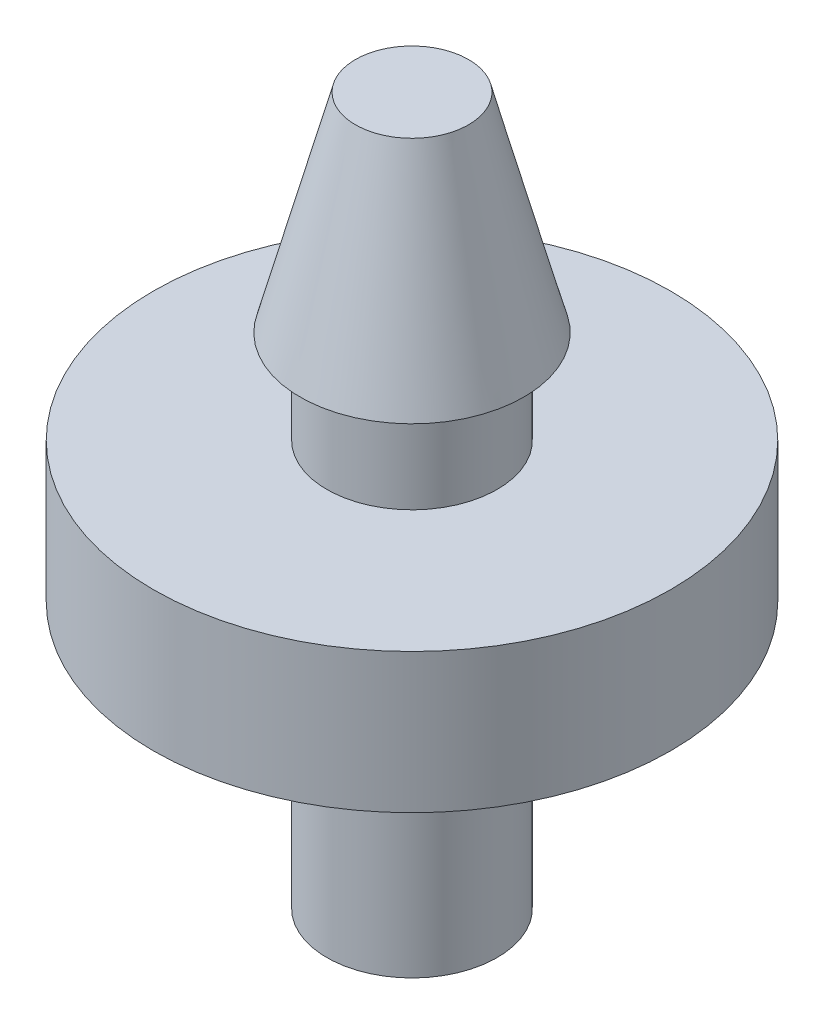
ISO-10303-21;
HEADER;
FILE_DESCRIPTION(('STEP AP214'),'2;1');
FILE_NAME('part.step','',(''),(''),'','','');
FILE_SCHEMA(('AUTOMOTIVE_DESIGN { 1 0 10303 214 1 1 1 1 }'));
ENDSEC;
DATA;
#1=APPLICATION_CONTEXT('core data for automotive mechanical design processes');
#2=APPLICATION_PROTOCOL_DEFINITION('international standard','automotive_design',2000,#1);
#3=PRODUCT_CONTEXT('',#1,'mechanical');
#4=PRODUCT('Part','Part','',(#3));
#5=PRODUCT_RELATED_PRODUCT_CATEGORY('part','',(#4));
#6=PRODUCT_DEFINITION_FORMATION('','',#4);
#7=PRODUCT_DEFINITION_CONTEXT('part definition',#1,'design');
#8=PRODUCT_DEFINITION('design','',#6,#7);
#9=PRODUCT_DEFINITION_SHAPE('','',#8);
#10=(LENGTH_UNIT() NAMED_UNIT(*) SI_UNIT(.MILLI.,.METRE.));
#11=(NAMED_UNIT(*) PLANE_ANGLE_UNIT() SI_UNIT($,.RADIAN.));
#12=(NAMED_UNIT(*) SI_UNIT($,.STERADIAN.) SOLID_ANGLE_UNIT());
#13=UNCERTAINTY_MEASURE_WITH_UNIT(LENGTH_MEASURE(1.E-05),#10,'distance_accuracy_value','');
#14=(GEOMETRIC_REPRESENTATION_CONTEXT(3) GLOBAL_UNCERTAINTY_ASSIGNED_CONTEXT((#13)) GLOBAL_UNIT_ASSIGNED_CONTEXT((#10,
#11,#12)) REPRESENTATION_CONTEXT('',''));
#15=CARTESIAN_POINT('',(0.,0.,0.));
#16=DIRECTION('',(0.,0.,1.));
#17=DIRECTION('',(1.,0.,0.));
#18=AXIS2_PLACEMENT_3D('',#15,#16,#17);
#19=CARTESIAN_POINT('',(0.,0.,0.));
#20=DIRECTION('',(0.,-1.,0.));
#21=DIRECTION('',(0.,0.,-1.));
#22=AXIS2_PLACEMENT_3D('',#19,#20,#21);
#23=PLANE('',#22);
#24=CARTESIAN_POINT('',(0.,0.,0.));
#25=DIRECTION('',(0.,-1.,0.));
#26=DIRECTION('',(0.,0.,-1.));
#27=AXIS2_PLACEMENT_3D('',#24,#25,#26);
#28=CIRCLE('',#27,2.025);
#29=CARTESIAN_POINT('',(0.,0.,-2.025));
#30=VERTEX_POINT('',#29);
#31=EDGE_CURVE('E72',#30,#30,#28,.T.);
#32=ORIENTED_EDGE('',*,*,#31,.T.);
#33=EDGE_LOOP('',(#32));
#34=FACE_BOUND('',#33,.T.);
#35=ADVANCED_FACE('F37',(#34),#23,.T.);
#36=CARTESIAN_POINT('',(0.,16.81,0.));
#37=DIRECTION('',(0.,1.,0.));
#38=DIRECTION('',(0.,0.,1.));
#39=AXIS2_PLACEMENT_3D('',#36,#37,#38);
#40=PLANE('',#39);
#41=CARTESIAN_POINT('',(0.,16.81,0.));
#42=DIRECTION('',(0.,-1.,0.));
#43=DIRECTION('',(0.,0.,-1.));
#44=AXIS2_PLACEMENT_3D('',#41,#42,#43);
#45=CIRCLE('',#44,1.345);
#46=CARTESIAN_POINT('',(0.,16.81,-1.345));
#47=VERTEX_POINT('',#46);
#48=EDGE_CURVE('E10',#47,#47,#45,.T.);
#49=ORIENTED_EDGE('',*,*,#48,.F.);
#50=EDGE_LOOP('',(#49));
#51=FACE_BOUND('',#50,.T.);
#52=ADVANCED_FACE('F90',(#51),#40,.T.);
#53=CARTESIAN_POINT('',(0.,11.86,0.));
#54=DIRECTION('',(0.,-1.,0.));
#55=DIRECTION('',(0.,0.,-1.));
#56=AXIS2_PLACEMENT_3D('',#53,#54,#55);
#57=CONICAL_SURFACE('',#56,2.66,0.25965911445196);
#58=ORIENTED_EDGE('',*,*,#48,.T.);
#59=EDGE_LOOP('',(#58));
#60=FACE_BOUND('',#59,.T.);
#61=CARTESIAN_POINT('',(0.,11.86,0.));
#62=DIRECTION('',(0.,-1.,0.));
#63=DIRECTION('',(0.,0.,-1.));
#64=AXIS2_PLACEMENT_3D('',#61,#62,#63);
#65=CIRCLE('',#64,2.66);
#66=CARTESIAN_POINT('',(0.,11.86,-2.66));
#67=VERTEX_POINT('',#66);
#68=EDGE_CURVE('E44',#67,#67,#65,.T.);
#69=ORIENTED_EDGE('',*,*,#68,.F.);
#70=EDGE_LOOP('',(#69));
#71=FACE_BOUND('',#70,.T.);
#72=ADVANCED_FACE('F94',(#60,#71),#57,.T.);
#73=CARTESIAN_POINT('',(0.,11.86,0.));
#74=DIRECTION('',(0.,-1.,0.));
#75=DIRECTION('',(0.,0.,-1.));
#76=AXIS2_PLACEMENT_3D('',#73,#74,#75);
#77=PLANE('',#76);
#78=ORIENTED_EDGE('',*,*,#68,.T.);
#79=EDGE_LOOP('',(#78));
#80=FACE_BOUND('',#79,.T.);
#81=CARTESIAN_POINT('',(0.,11.86,0.));
#82=DIRECTION('',(0.,-1.,0.));
#83=DIRECTION('',(0.,0.,-1.));
#84=AXIS2_PLACEMENT_3D('',#81,#82,#83);
#85=CIRCLE('',#84,2.025);
#86=CARTESIAN_POINT('',(0.,11.86,-2.025));
#87=VERTEX_POINT('',#86);
#88=EDGE_CURVE('E49',#87,#87,#85,.T.);
#89=ORIENTED_EDGE('',*,*,#88,.F.);
#90=EDGE_LOOP('',(#89));
#91=FACE_BOUND('',#90,.T.);
#92=ADVANCED_FACE('F99',(#80,#91),#77,.T.);
#93=CARTESIAN_POINT('',(0.,-0.0958633093525176,0.));
#94=DIRECTION('',(0.,-1.,0.));
#95=DIRECTION('',(0.,0.,-1.));
#96=AXIS2_PLACEMENT_3D('',#93,#94,#95);
#97=CYLINDRICAL_SURFACE('',#96,2.025);
#98=ORIENTED_EDGE('',*,*,#88,.T.);
#99=EDGE_LOOP('',(#98));
#100=FACE_BOUND('',#99,.T.);
#101=CARTESIAN_POINT('',(0.,9.64,0.));
#102=DIRECTION('',(0.,-1.,0.));
#103=DIRECTION('',(0.,0.,-1.));
#104=AXIS2_PLACEMENT_3D('',#101,#102,#103);
#105=CIRCLE('',#104,2.025);
#106=CARTESIAN_POINT('',(0.,9.64,-2.025));
#107=VERTEX_POINT('',#106);
#108=EDGE_CURVE('E54',#107,#107,#105,.T.);
#109=ORIENTED_EDGE('',*,*,#108,.F.);
#110=EDGE_LOOP('',(#109));
#111=FACE_BOUND('',#110,.T.);
#112=ADVANCED_FACE('F104',(#100,#111),#97,.T.);
#113=CARTESIAN_POINT('',(0.,9.64,0.));
#114=DIRECTION('',(0.,1.,0.));
#115=DIRECTION('',(0.,0.,1.));
#116=AXIS2_PLACEMENT_3D('',#113,#114,#115);
#117=PLANE('',#116);
#118=ORIENTED_EDGE('',*,*,#108,.T.);
#119=EDGE_LOOP('',(#118));
#120=FACE_BOUND('',#119,.T.);
#121=CARTESIAN_POINT('',(0.,9.64,0.));
#122=DIRECTION('',(0.,-1.,0.));
#123=DIRECTION('',(0.,0.,-1.));
#124=AXIS2_PLACEMENT_3D('',#121,#122,#123);
#125=CIRCLE('',#124,6.15);
#126=CARTESIAN_POINT('',(0.,9.64,-6.15));
#127=VERTEX_POINT('',#126);
#128=EDGE_CURVE('E60',#127,#127,#125,.T.);
#129=ORIENTED_EDGE('',*,*,#128,.F.);
#130=EDGE_LOOP('',(#129));
#131=FACE_BOUND('',#130,.T.);
#132=ADVANCED_FACE('F107',(#120,#131),#117,.T.);
#133=CARTESIAN_POINT('',(0.,-0.0958633093525176,0.));
#134=DIRECTION('',(0.,-1.,0.));
#135=DIRECTION('',(0.,0.,-1.));
#136=AXIS2_PLACEMENT_3D('',#133,#134,#135);
#137=CYLINDRICAL_SURFACE('',#136,6.15);
#138=ORIENTED_EDGE('',*,*,#128,.T.);
#139=EDGE_LOOP('',(#138));
#140=FACE_BOUND('',#139,.T.);
#141=CARTESIAN_POINT('',(0.,6.32,0.));
#142=DIRECTION('',(0.,-1.,0.));
#143=DIRECTION('',(0.,0.,-1.));
#144=AXIS2_PLACEMENT_3D('',#141,#142,#143);
#145=CIRCLE('',#144,6.15);
#146=CARTESIAN_POINT('',(0.,6.32,-6.15));
#147=VERTEX_POINT('',#146);
#148=EDGE_CURVE('E64',#147,#147,#145,.T.);
#149=ORIENTED_EDGE('',*,*,#148,.F.);
#150=EDGE_LOOP('',(#149));
#151=FACE_BOUND('',#150,.T.);
#152=ADVANCED_FACE('F86',(#140,#151),#137,.T.);
#153=CARTESIAN_POINT('',(0.,6.32,0.));
#154=DIRECTION('',(0.,-1.,0.));
#155=DIRECTION('',(0.,0.,-1.));
#156=AXIS2_PLACEMENT_3D('',#153,#154,#155);
#157=PLANE('',#156);
#158=ORIENTED_EDGE('',*,*,#148,.T.);
#159=EDGE_LOOP('',(#158));
#160=FACE_BOUND('',#159,.T.);
#161=CARTESIAN_POINT('',(0.,6.32,0.));
#162=DIRECTION('',(0.,-1.,0.));
#163=DIRECTION('',(0.,0.,-1.));
#164=AXIS2_PLACEMENT_3D('',#161,#162,#163);
#165=CIRCLE('',#164,2.025);
#166=CARTESIAN_POINT('',(0.,6.32,-2.025));
#167=VERTEX_POINT('',#166);
#168=EDGE_CURVE('E68',#167,#167,#165,.T.);
#169=ORIENTED_EDGE('',*,*,#168,.F.);
#170=EDGE_LOOP('',(#169));
#171=FACE_BOUND('',#170,.T.);
#172=ADVANCED_FACE('F80',(#160,#171),#157,.T.);
#173=CARTESIAN_POINT('',(0.,-0.0958633093525176,0.));
#174=DIRECTION('',(0.,-1.,0.));
#175=DIRECTION('',(0.,0.,-1.));
#176=AXIS2_PLACEMENT_3D('',#173,#174,#175);
#177=CYLINDRICAL_SURFACE('',#176,2.025);
#178=ORIENTED_EDGE('',*,*,#168,.T.);
#179=EDGE_LOOP('',(#178));
#180=FACE_BOUND('',#179,.T.);
#181=ORIENTED_EDGE('',*,*,#31,.F.);
#182=EDGE_LOOP('',(#181));
#183=FACE_BOUND('',#182,.T.);
#184=ADVANCED_FACE('F78',(#180,#183),#177,.T.);
#185=CLOSED_SHELL('',(#35,#52,#72,#92,#112,#132,#152,#172,#184));
#186=MANIFOLD_SOLID_BREP('B2',#185);
#187=ADVANCED_BREP_SHAPE_REPRESENTATION('',(#18,#186),#14);
#188=SHAPE_DEFINITION_REPRESENTATION(#9,#187);
ENDSEC;
END-ISO-10303-21;
